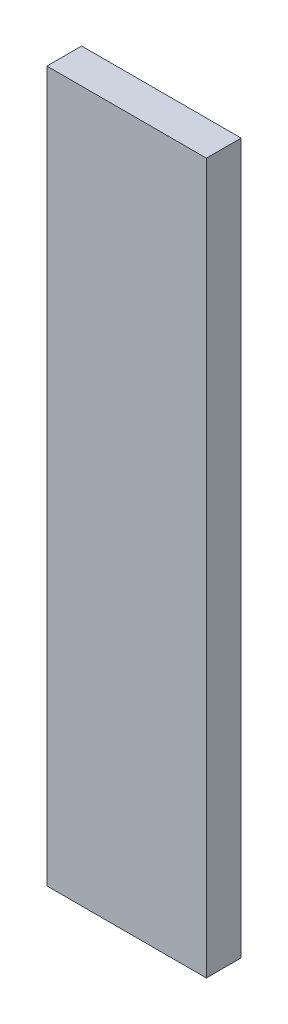
ISO-10303-21;
HEADER;
FILE_DESCRIPTION(('STEP AP214'),'2;1');
FILE_NAME('part.step','',(''),(''),'','','');
FILE_SCHEMA(('AUTOMOTIVE_DESIGN { 1 0 10303 214 1 1 1 1 }'));
ENDSEC;
DATA;
#1=APPLICATION_CONTEXT('core data for automotive mechanical design processes');
#2=APPLICATION_PROTOCOL_DEFINITION('international standard','automotive_design',2000,#1);
#3=PRODUCT_CONTEXT('',#1,'mechanical');
#4=PRODUCT('Part','Part','',(#3));
#5=PRODUCT_RELATED_PRODUCT_CATEGORY('part','',(#4));
#6=PRODUCT_DEFINITION_FORMATION('','',#4);
#7=PRODUCT_DEFINITION_CONTEXT('part definition',#1,'design');
#8=PRODUCT_DEFINITION('design','',#6,#7);
#9=PRODUCT_DEFINITION_SHAPE('','',#8);
#10=(LENGTH_UNIT() NAMED_UNIT(*) SI_UNIT(.MILLI.,.METRE.));
#11=(NAMED_UNIT(*) PLANE_ANGLE_UNIT() SI_UNIT($,.RADIAN.));
#12=(NAMED_UNIT(*) SI_UNIT($,.STERADIAN.) SOLID_ANGLE_UNIT());
#13=UNCERTAINTY_MEASURE_WITH_UNIT(LENGTH_MEASURE(1.E-05),#10,'distance_accuracy_value','');
#14=(GEOMETRIC_REPRESENTATION_CONTEXT(3) GLOBAL_UNCERTAINTY_ASSIGNED_CONTEXT((#13)) GLOBAL_UNIT_ASSIGNED_CONTEXT((#10,
#11,#12)) REPRESENTATION_CONTEXT('',''));
#15=CARTESIAN_POINT('',(0.,0.,0.));
#16=DIRECTION('',(0.,0.,1.));
#17=DIRECTION('',(1.,0.,0.));
#18=AXIS2_PLACEMENT_3D('',#15,#16,#17);
#19=CARTESIAN_POINT('',(-21.7182300884955,31.0897345132743,7.));
#20=DIRECTION('',(1.,0.,0.));
#21=DIRECTION('',(0.,1.,0.));
#22=AXIS2_PLACEMENT_3D('',#19,#20,#21);
#23=PLANE('',#22);
#24=DIRECTION('',(0.,-1.,0.));
#25=VECTOR('',#24,1.);
#26=CARTESIAN_POINT('',(-21.7182300884955,31.0897345132743,0.));
#27=LINE('',#26,#25);
#28=CARTESIAN_POINT('',(-21.7182300884955,31.0897345132743,0.));
#29=VERTEX_POINT('',#28);
#30=CARTESIAN_POINT('',(-21.7182300884955,-111.910265486726,0.));
#31=VERTEX_POINT('',#30);
#32=EDGE_CURVE('E107',#29,#31,#27,.T.);
#33=ORIENTED_EDGE('',*,*,#32,.T.);
#34=DIRECTION('',(0.,0.,-1.));
#35=VECTOR('',#34,1.);
#36=CARTESIAN_POINT('',(-21.7182300884955,-111.910265486726,7.));
#37=LINE('',#36,#35);
#38=CARTESIAN_POINT('',(-21.7182300884955,-111.910265486726,7.));
#39=VERTEX_POINT('',#38);
#40=EDGE_CURVE('E11',#39,#31,#37,.T.);
#41=ORIENTED_EDGE('',*,*,#40,.F.);
#42=DIRECTION('',(0.,-1.,0.));
#43=VECTOR('',#42,1.);
#44=CARTESIAN_POINT('',(-21.7182300884955,31.0897345132743,7.));
#45=LINE('',#44,#43);
#46=CARTESIAN_POINT('',(-21.7182300884955,31.0897345132743,7.));
#47=VERTEX_POINT('',#46);
#48=EDGE_CURVE('E91',#47,#39,#45,.T.);
#49=ORIENTED_EDGE('',*,*,#48,.F.);
#50=DIRECTION('',(0.,0.,-1.));
#51=VECTOR('',#50,1.);
#52=CARTESIAN_POINT('',(-21.7182300884955,31.0897345132743,7.));
#53=LINE('',#52,#51);
#54=EDGE_CURVE('E103',#47,#29,#53,.T.);
#55=ORIENTED_EDGE('',*,*,#54,.T.);
#56=EDGE_LOOP('',(#33,#41,#49,#55));
#57=FACE_BOUND('',#56,.T.);
#58=ADVANCED_FACE('F39',(#57),#23,.F.);
#59=CARTESIAN_POINT('',(-21.7182300884955,-111.910265486726,7.));
#60=DIRECTION('',(0.,1.,0.));
#61=DIRECTION('',(0.,0.,1.));
#62=AXIS2_PLACEMENT_3D('',#59,#60,#61);
#63=PLANE('',#62);
#64=DIRECTION('',(1.,0.,0.));
#65=VECTOR('',#64,1.);
#66=CARTESIAN_POINT('',(-21.7182300884955,-111.910265486726,0.));
#67=LINE('',#66,#65);
#68=CARTESIAN_POINT('',(10.4017699115045,-111.910265486726,0.));
#69=VERTEX_POINT('',#68);
#70=EDGE_CURVE('E96',#31,#69,#67,.T.);
#71=ORIENTED_EDGE('',*,*,#70,.T.);
#72=DIRECTION('',(0.,0.,-1.));
#73=VECTOR('',#72,1.);
#74=CARTESIAN_POINT('',(10.4017699115045,-111.910265486726,7.));
#75=LINE('',#74,#73);
#76=CARTESIAN_POINT('',(10.4017699115045,-111.910265486726,7.));
#77=VERTEX_POINT('',#76);
#78=EDGE_CURVE('E48',#77,#69,#75,.T.);
#79=ORIENTED_EDGE('',*,*,#78,.F.);
#80=DIRECTION('',(1.,0.,0.));
#81=VECTOR('',#80,1.);
#82=CARTESIAN_POINT('',(-21.7182300884955,-111.910265486726,7.));
#83=LINE('',#82,#81);
#84=EDGE_CURVE('E86',#39,#77,#83,.T.);
#85=ORIENTED_EDGE('',*,*,#84,.F.);
#86=ORIENTED_EDGE('',*,*,#40,.T.);
#87=EDGE_LOOP('',(#71,#79,#85,#86));
#88=FACE_BOUND('',#87,.T.);
#89=ADVANCED_FACE('F95',(#88),#63,.F.);
#90=CARTESIAN_POINT('',(10.4017699115044,31.0897345132743,7.));
#91=DIRECTION('',(-1.,0.,0.));
#92=DIRECTION('',(0.,-1.,0.));
#93=AXIS2_PLACEMENT_3D('',#90,#91,#92);
#94=PLANE('',#93);
#95=DIRECTION('',(0.,1.,0.));
#96=VECTOR('',#95,1.);
#97=CARTESIAN_POINT('',(10.4017699115044,31.0897345132743,0.));
#98=LINE('',#97,#96);
#99=CARTESIAN_POINT('',(10.4017699115044,31.0897345132743,0.));
#100=VERTEX_POINT('',#99);
#101=EDGE_CURVE('E73',#69,#100,#98,.T.);
#102=ORIENTED_EDGE('',*,*,#101,.T.);
#103=DIRECTION('',(0.,0.,-1.));
#104=VECTOR('',#103,1.);
#105=CARTESIAN_POINT('',(10.4017699115044,31.0897345132743,7.));
#106=LINE('',#105,#104);
#107=CARTESIAN_POINT('',(10.4017699115044,31.0897345132743,7.));
#108=VERTEX_POINT('',#107);
#109=EDGE_CURVE('E98',#108,#100,#106,.T.);
#110=ORIENTED_EDGE('',*,*,#109,.F.);
#111=DIRECTION('',(0.,1.,0.));
#112=VECTOR('',#111,1.);
#113=CARTESIAN_POINT('',(10.4017699115044,31.0897345132743,7.));
#114=LINE('',#113,#112);
#115=EDGE_CURVE('E89',#77,#108,#114,.T.);
#116=ORIENTED_EDGE('',*,*,#115,.F.);
#117=ORIENTED_EDGE('',*,*,#78,.T.);
#118=EDGE_LOOP('',(#102,#110,#116,#117));
#119=FACE_BOUND('',#118,.T.);
#120=ADVANCED_FACE('F99',(#119),#94,.F.);
#121=CARTESIAN_POINT('',(-21.7182300884955,31.0897345132743,7.));
#122=DIRECTION('',(0.,-1.,0.));
#123=DIRECTION('',(0.,0.,-1.));
#124=AXIS2_PLACEMENT_3D('',#121,#122,#123);
#125=PLANE('',#124);
#126=DIRECTION('',(-1.,0.,0.));
#127=VECTOR('',#126,1.);
#128=CARTESIAN_POINT('',(-21.7182300884955,31.0897345132743,0.));
#129=LINE('',#128,#127);
#130=EDGE_CURVE('E79',#100,#29,#129,.T.);
#131=ORIENTED_EDGE('',*,*,#130,.T.);
#132=ORIENTED_EDGE('',*,*,#54,.F.);
#133=DIRECTION('',(-1.,0.,0.));
#134=VECTOR('',#133,1.);
#135=CARTESIAN_POINT('',(-21.7182300884955,31.0897345132743,7.));
#136=LINE('',#135,#134);
#137=EDGE_CURVE('E56',#108,#47,#136,.T.);
#138=ORIENTED_EDGE('',*,*,#137,.F.);
#139=ORIENTED_EDGE('',*,*,#109,.T.);
#140=EDGE_LOOP('',(#131,#132,#138,#139));
#141=FACE_BOUND('',#140,.T.);
#142=ADVANCED_FACE('F120',(#141),#125,.F.);
#143=CARTESIAN_POINT('',(0.,0.,7.));
#144=DIRECTION('',(0.,0.,1.));
#145=DIRECTION('',(1.,0.,0.));
#146=AXIS2_PLACEMENT_3D('',#143,#144,#145);
#147=PLANE('',#146);
#148=ORIENTED_EDGE('',*,*,#48,.T.);
#149=ORIENTED_EDGE('',*,*,#84,.T.);
#150=ORIENTED_EDGE('',*,*,#115,.T.);
#151=ORIENTED_EDGE('',*,*,#137,.T.);
#152=EDGE_LOOP('',(#148,#149,#150,#151));
#153=FACE_BOUND('',#152,.T.);
#154=ADVANCED_FACE('F87',(#153),#147,.T.);
#155=CARTESIAN_POINT('',(0.,0.,0.));
#156=DIRECTION('',(0.,0.,1.));
#157=DIRECTION('',(1.,0.,0.));
#158=AXIS2_PLACEMENT_3D('',#155,#156,#157);
#159=PLANE('',#158);
#160=ORIENTED_EDGE('',*,*,#32,.F.);
#161=ORIENTED_EDGE('',*,*,#130,.F.);
#162=ORIENTED_EDGE('',*,*,#101,.F.);
#163=ORIENTED_EDGE('',*,*,#70,.F.);
#164=EDGE_LOOP('',(#160,#161,#162,#163));
#165=FACE_BOUND('',#164,.T.);
#166=ADVANCED_FACE('F123',(#165),#159,.F.);
#167=CLOSED_SHELL('',(#58,#89,#120,#142,#154,#166));
#168=MANIFOLD_SOLID_BREP('B2',#167);
#169=ADVANCED_BREP_SHAPE_REPRESENTATION('',(#18,#168),#14);
#170=SHAPE_DEFINITION_REPRESENTATION(#9,#169);
ENDSEC;
END-ISO-10303-21;
